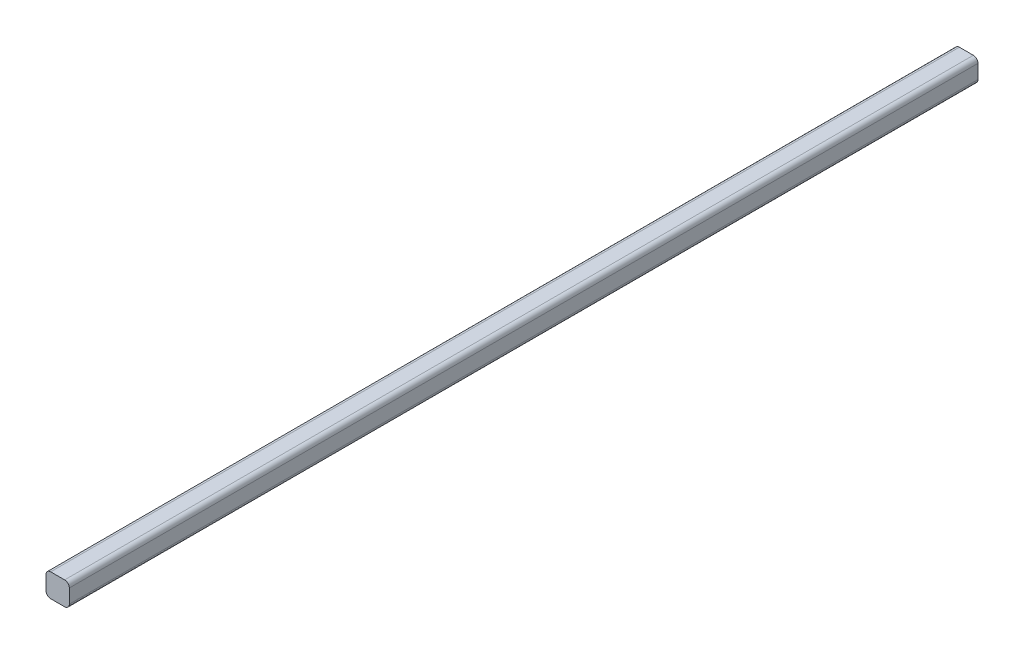
ISO-10303-21;
HEADER;
FILE_DESCRIPTION(('STEP AP214'),'2;1');
FILE_NAME('part.step','',(''),(''),'','','');
FILE_SCHEMA(('AUTOMOTIVE_DESIGN { 1 0 10303 214 1 1 1 1 }'));
ENDSEC;
DATA;
#1=APPLICATION_CONTEXT('core data for automotive mechanical design processes');
#2=APPLICATION_PROTOCOL_DEFINITION('international standard','automotive_design',2000,#1);
#3=PRODUCT_CONTEXT('',#1,'mechanical');
#4=PRODUCT('Part','Part','',(#3));
#5=PRODUCT_RELATED_PRODUCT_CATEGORY('part','',(#4));
#6=PRODUCT_DEFINITION_FORMATION('','',#4);
#7=PRODUCT_DEFINITION_CONTEXT('part definition',#1,'design');
#8=PRODUCT_DEFINITION('design','',#6,#7);
#9=PRODUCT_DEFINITION_SHAPE('','',#8);
#10=(LENGTH_UNIT() NAMED_UNIT(*) SI_UNIT(.MILLI.,.METRE.));
#11=(NAMED_UNIT(*) PLANE_ANGLE_UNIT() SI_UNIT($,.RADIAN.));
#12=(NAMED_UNIT(*) SI_UNIT($,.STERADIAN.) SOLID_ANGLE_UNIT());
#13=UNCERTAINTY_MEASURE_WITH_UNIT(LENGTH_MEASURE(1.E-05),#10,'distance_accuracy_value','');
#14=(GEOMETRIC_REPRESENTATION_CONTEXT(3) GLOBAL_UNCERTAINTY_ASSIGNED_CONTEXT((#13)) GLOBAL_UNIT_ASSIGNED_CONTEXT((#10,
#11,#12)) REPRESENTATION_CONTEXT('',''));
#15=CARTESIAN_POINT('',(0.,0.,0.));
#16=DIRECTION('',(0.,0.,1.));
#17=DIRECTION('',(1.,0.,0.));
#18=AXIS2_PLACEMENT_3D('',#15,#16,#17);
#19=CARTESIAN_POINT('',(0.,0.,1950.));
#20=DIRECTION('',(1.,0.,0.));
#21=DIRECTION('',(0.,0.,-1.));
#22=AXIS2_PLACEMENT_3D('',#19,#20,#21);
#23=PLANE('',#22);
#24=DIRECTION('',(0.,-1.,0.));
#25=VECTOR('',#24,1.);
#26=CARTESIAN_POINT('',(0.,0.,0.));
#27=LINE('',#26,#25);
#28=CARTESIAN_POINT('',(0.,40.,0.));
#29=VERTEX_POINT('',#28);
#30=CARTESIAN_POINT('',(0.,10.,0.));
#31=VERTEX_POINT('',#30);
#32=EDGE_CURVE('E125',#29,#31,#27,.T.);
#33=ORIENTED_EDGE('',*,*,#32,.T.);
#34=DIRECTION('',(0.,0.,-1.));
#35=VECTOR('',#34,1.);
#36=CARTESIAN_POINT('',(0.,10.,1950.));
#37=LINE('',#36,#35);
#38=CARTESIAN_POINT('',(0.,10.,1950.));
#39=VERTEX_POINT('',#38);
#40=EDGE_CURVE('E103',#31,#39,#37,.F.);
#41=ORIENTED_EDGE('',*,*,#40,.T.);
#42=DIRECTION('',(0.,-1.,0.));
#43=VECTOR('',#42,1.);
#44=CARTESIAN_POINT('',(0.,0.,1950.));
#45=LINE('',#44,#43);
#46=CARTESIAN_POINT('',(0.,40.,1950.));
#47=VERTEX_POINT('',#46);
#48=EDGE_CURVE('E134',#47,#39,#45,.T.);
#49=ORIENTED_EDGE('',*,*,#48,.F.);
#50=DIRECTION('',(0.,0.,-1.));
#51=VECTOR('',#50,1.);
#52=CARTESIAN_POINT('',(0.,40.,1950.));
#53=LINE('',#52,#51);
#54=EDGE_CURVE('E108',#47,#29,#53,.T.);
#55=ORIENTED_EDGE('',*,*,#54,.T.);
#56=EDGE_LOOP('',(#33,#41,#49,#55));
#57=FACE_BOUND('',#56,.T.);
#58=ADVANCED_FACE('F33',(#57),#23,.F.);
#59=CARTESIAN_POINT('',(0.,0.,1950.));
#60=DIRECTION('',(0.,1.,0.));
#61=DIRECTION('',(0.,0.,1.));
#62=AXIS2_PLACEMENT_3D('',#59,#60,#61);
#63=PLANE('',#62);
#64=DIRECTION('',(1.,0.,0.));
#65=VECTOR('',#64,1.);
#66=CARTESIAN_POINT('',(0.,0.,1950.));
#67=LINE('',#66,#65);
#68=CARTESIAN_POINT('',(10.,0.,1950.));
#69=VERTEX_POINT('',#68);
#70=CARTESIAN_POINT('',(40.,0.,1950.));
#71=VERTEX_POINT('',#70);
#72=EDGE_CURVE('E118',#69,#71,#67,.T.);
#73=ORIENTED_EDGE('',*,*,#72,.F.);
#74=DIRECTION('',(0.,0.,-1.));
#75=VECTOR('',#74,1.);
#76=CARTESIAN_POINT('',(10.,0.,1950.));
#77=LINE('',#76,#75);
#78=CARTESIAN_POINT('',(10.,0.,0.));
#79=VERTEX_POINT('',#78);
#80=EDGE_CURVE('E102',#69,#79,#77,.T.);
#81=ORIENTED_EDGE('',*,*,#80,.T.);
#82=DIRECTION('',(1.,0.,0.));
#83=VECTOR('',#82,1.);
#84=CARTESIAN_POINT('',(0.,0.,0.));
#85=LINE('',#84,#83);
#86=CARTESIAN_POINT('',(40.,0.,0.));
#87=VERTEX_POINT('',#86);
#88=EDGE_CURVE('E115',#79,#87,#85,.T.);
#89=ORIENTED_EDGE('',*,*,#88,.T.);
#90=DIRECTION('',(0.,0.,-1.));
#91=VECTOR('',#90,1.);
#92=CARTESIAN_POINT('',(40.,0.,1950.));
#93=LINE('',#92,#91);
#94=EDGE_CURVE('E120',#87,#71,#93,.F.);
#95=ORIENTED_EDGE('',*,*,#94,.T.);
#96=EDGE_LOOP('',(#73,#81,#89,#95));
#97=FACE_BOUND('',#96,.T.);
#98=ADVANCED_FACE('F114',(#97),#63,.F.);
#99=CARTESIAN_POINT('',(50.,0.,1950.));
#100=DIRECTION('',(-1.,0.,0.));
#101=DIRECTION('',(0.,0.,1.));
#102=AXIS2_PLACEMENT_3D('',#99,#100,#101);
#103=PLANE('',#102);
#104=DIRECTION('',(0.,1.,0.));
#105=VECTOR('',#104,1.);
#106=CARTESIAN_POINT('',(50.,0.,1950.));
#107=LINE('',#106,#105);
#108=CARTESIAN_POINT('',(50.,10.,1950.));
#109=VERTEX_POINT('',#108);
#110=CARTESIAN_POINT('',(50.,40.,1950.));
#111=VERTEX_POINT('',#110);
#112=EDGE_CURVE('E168',#109,#111,#107,.T.);
#113=ORIENTED_EDGE('',*,*,#112,.F.);
#114=DIRECTION('',(0.,0.,-1.));
#115=VECTOR('',#114,1.);
#116=CARTESIAN_POINT('',(50.,10.,1950.));
#117=LINE('',#116,#115);
#118=CARTESIAN_POINT('',(50.,10.,0.));
#119=VERTEX_POINT('',#118);
#120=EDGE_CURVE('E153',#109,#119,#117,.T.);
#121=ORIENTED_EDGE('',*,*,#120,.T.);
#122=DIRECTION('',(0.,1.,0.));
#123=VECTOR('',#122,1.);
#124=CARTESIAN_POINT('',(50.,0.,0.));
#125=LINE('',#124,#123);
#126=CARTESIAN_POINT('',(50.,40.,0.));
#127=VERTEX_POINT('',#126);
#128=EDGE_CURVE('E124',#119,#127,#125,.T.);
#129=ORIENTED_EDGE('',*,*,#128,.T.);
#130=DIRECTION('',(0.,0.,-1.));
#131=VECTOR('',#130,1.);
#132=CARTESIAN_POINT('',(50.,40.,1950.));
#133=LINE('',#132,#131);
#134=EDGE_CURVE('E151',#127,#111,#133,.F.);
#135=ORIENTED_EDGE('',*,*,#134,.T.);
#136=EDGE_LOOP('',(#113,#121,#129,#135));
#137=FACE_BOUND('',#136,.T.);
#138=ADVANCED_FACE('F179',(#137),#103,.F.);
#139=CARTESIAN_POINT('',(0.,50.,1950.));
#140=DIRECTION('',(0.,-1.,0.));
#141=DIRECTION('',(0.,0.,-1.));
#142=AXIS2_PLACEMENT_3D('',#139,#140,#141);
#143=PLANE('',#142);
#144=DIRECTION('',(-1.,0.,0.));
#145=VECTOR('',#144,1.);
#146=CARTESIAN_POINT('',(0.,50.,0.));
#147=LINE('',#146,#145);
#148=CARTESIAN_POINT('',(40.,50.,0.));
#149=VERTEX_POINT('',#148);
#150=CARTESIAN_POINT('',(10.,50.,0.));
#151=VERTEX_POINT('',#150);
#152=EDGE_CURVE('E128',#149,#151,#147,.T.);
#153=ORIENTED_EDGE('',*,*,#152,.T.);
#154=DIRECTION('',(0.,0.,-1.));
#155=VECTOR('',#154,1.);
#156=CARTESIAN_POINT('',(10.,50.,1950.));
#157=LINE('',#156,#155);
#158=CARTESIAN_POINT('',(10.,50.,1950.));
#159=VERTEX_POINT('',#158);
#160=EDGE_CURVE('E11',#151,#159,#157,.F.);
#161=ORIENTED_EDGE('',*,*,#160,.T.);
#162=DIRECTION('',(-1.,0.,0.));
#163=VECTOR('',#162,1.);
#164=CARTESIAN_POINT('',(0.,50.,1950.));
#165=LINE('',#164,#163);
#166=CARTESIAN_POINT('',(40.,50.,1950.));
#167=VERTEX_POINT('',#166);
#168=EDGE_CURVE('E135',#167,#159,#165,.T.);
#169=ORIENTED_EDGE('',*,*,#168,.F.);
#170=DIRECTION('',(0.,0.,-1.));
#171=VECTOR('',#170,1.);
#172=CARTESIAN_POINT('',(40.,50.,1950.));
#173=LINE('',#172,#171);
#174=EDGE_CURVE('E41',#167,#149,#173,.T.);
#175=ORIENTED_EDGE('',*,*,#174,.T.);
#176=EDGE_LOOP('',(#153,#161,#169,#175));
#177=FACE_BOUND('',#176,.T.);
#178=ADVANCED_FACE('F158',(#177),#143,.F.);
#179=CARTESIAN_POINT('',(0.,0.,1950.));
#180=DIRECTION('',(0.,0.,-1.));
#181=DIRECTION('',(-1.,0.,0.));
#182=AXIS2_PLACEMENT_3D('',#179,#180,#181);
#183=PLANE('',#182);
#184=ORIENTED_EDGE('',*,*,#48,.T.);
#185=CARTESIAN_POINT('',(10.,10.,1950.));
#186=DIRECTION('',(0.,0.,-1.));
#187=DIRECTION('',(-1.,0.,0.));
#188=AXIS2_PLACEMENT_3D('',#185,#186,#187);
#189=CIRCLE('',#188,10.);
#190=EDGE_CURVE('E149',#39,#69,#189,.F.);
#191=ORIENTED_EDGE('',*,*,#190,.T.);
#192=ORIENTED_EDGE('',*,*,#72,.T.);
#193=CARTESIAN_POINT('',(40.,10.,1950.));
#194=DIRECTION('',(0.,0.,-1.));
#195=DIRECTION('',(-1.,0.,0.));
#196=AXIS2_PLACEMENT_3D('',#193,#194,#195);
#197=CIRCLE('',#196,10.);
#198=EDGE_CURVE('E147',#71,#109,#197,.F.);
#199=ORIENTED_EDGE('',*,*,#198,.T.);
#200=ORIENTED_EDGE('',*,*,#112,.T.);
#201=CARTESIAN_POINT('',(40.,40.,1950.));
#202=DIRECTION('',(0.,0.,-1.));
#203=DIRECTION('',(-1.,0.,0.));
#204=AXIS2_PLACEMENT_3D('',#201,#202,#203);
#205=CIRCLE('',#204,10.);
#206=EDGE_CURVE('E53',#111,#167,#205,.F.);
#207=ORIENTED_EDGE('',*,*,#206,.T.);
#208=ORIENTED_EDGE('',*,*,#168,.T.);
#209=CARTESIAN_POINT('',(10.,40.,1950.));
#210=DIRECTION('',(0.,0.,-1.));
#211=DIRECTION('',(-1.,0.,0.));
#212=AXIS2_PLACEMENT_3D('',#209,#210,#211);
#213=CIRCLE('',#212,10.);
#214=EDGE_CURVE('E145',#159,#47,#213,.F.);
#215=ORIENTED_EDGE('',*,*,#214,.T.);
#216=EDGE_LOOP('',(#184,#191,#192,#199,#200,#207,#208,#215));
#217=FACE_BOUND('',#216,.T.);
#218=ADVANCED_FACE('F171',(#217),#183,.F.);
#219=CARTESIAN_POINT('',(0.,0.,0.));
#220=DIRECTION('',(0.,0.,-1.));
#221=DIRECTION('',(-1.,0.,0.));
#222=AXIS2_PLACEMENT_3D('',#219,#220,#221);
#223=PLANE('',#222);
#224=ORIENTED_EDGE('',*,*,#88,.F.);
#225=CARTESIAN_POINT('',(10.,10.,0.));
#226=DIRECTION('',(0.,0.,-1.));
#227=DIRECTION('',(-1.,0.,0.));
#228=AXIS2_PLACEMENT_3D('',#225,#226,#227);
#229=CIRCLE('',#228,10.);
#230=EDGE_CURVE('E98',#79,#31,#229,.T.);
#231=ORIENTED_EDGE('',*,*,#230,.T.);
#232=ORIENTED_EDGE('',*,*,#32,.F.);
#233=CARTESIAN_POINT('',(10.,40.,0.));
#234=DIRECTION('',(0.,0.,-1.));
#235=DIRECTION('',(-1.,0.,0.));
#236=AXIS2_PLACEMENT_3D('',#233,#234,#235);
#237=CIRCLE('',#236,10.);
#238=EDGE_CURVE('E138',#29,#151,#237,.T.);
#239=ORIENTED_EDGE('',*,*,#238,.T.);
#240=ORIENTED_EDGE('',*,*,#152,.F.);
#241=CARTESIAN_POINT('',(40.,40.,0.));
#242=DIRECTION('',(0.,0.,-1.));
#243=DIRECTION('',(-1.,0.,0.));
#244=AXIS2_PLACEMENT_3D('',#241,#242,#243);
#245=CIRCLE('',#244,10.);
#246=EDGE_CURVE('E119',#149,#127,#245,.T.);
#247=ORIENTED_EDGE('',*,*,#246,.T.);
#248=ORIENTED_EDGE('',*,*,#128,.F.);
#249=CARTESIAN_POINT('',(40.,10.,0.));
#250=DIRECTION('',(0.,0.,-1.));
#251=DIRECTION('',(-1.,0.,0.));
#252=AXIS2_PLACEMENT_3D('',#249,#250,#251);
#253=CIRCLE('',#252,10.);
#254=EDGE_CURVE('E109',#119,#87,#253,.T.);
#255=ORIENTED_EDGE('',*,*,#254,.T.);
#256=EDGE_LOOP('',(#224,#231,#232,#239,#240,#247,#248,#255));
#257=FACE_BOUND('',#256,.T.);
#258=ADVANCED_FACE('F122',(#257),#223,.T.);
#259=CARTESIAN_POINT('',(10.,10.,1950.));
#260=DIRECTION('',(0.,0.,-1.));
#261=DIRECTION('',(-1.,0.,0.));
#262=AXIS2_PLACEMENT_3D('',#259,#260,#261);
#263=CYLINDRICAL_SURFACE('',#262,10.);
#264=ORIENTED_EDGE('',*,*,#190,.F.);
#265=ORIENTED_EDGE('',*,*,#40,.F.);
#266=ORIENTED_EDGE('',*,*,#230,.F.);
#267=ORIENTED_EDGE('',*,*,#80,.F.);
#268=EDGE_LOOP('',(#264,#265,#266,#267));
#269=FACE_BOUND('',#268,.T.);
#270=ADVANCED_FACE('F101',(#269),#263,.T.);
#271=CARTESIAN_POINT('',(40.,10.,1950.));
#272=DIRECTION('',(0.,0.,-1.));
#273=DIRECTION('',(-1.,0.,0.));
#274=AXIS2_PLACEMENT_3D('',#271,#272,#273);
#275=CYLINDRICAL_SURFACE('',#274,10.);
#276=ORIENTED_EDGE('',*,*,#198,.F.);
#277=ORIENTED_EDGE('',*,*,#94,.F.);
#278=ORIENTED_EDGE('',*,*,#254,.F.);
#279=ORIENTED_EDGE('',*,*,#120,.F.);
#280=EDGE_LOOP('',(#276,#277,#278,#279));
#281=FACE_BOUND('',#280,.T.);
#282=ADVANCED_FACE('F191',(#281),#275,.T.);
#283=CARTESIAN_POINT('',(10.,40.,1950.));
#284=DIRECTION('',(0.,0.,-1.));
#285=DIRECTION('',(-1.,0.,0.));
#286=AXIS2_PLACEMENT_3D('',#283,#284,#285);
#287=CYLINDRICAL_SURFACE('',#286,10.);
#288=ORIENTED_EDGE('',*,*,#214,.F.);
#289=ORIENTED_EDGE('',*,*,#160,.F.);
#290=ORIENTED_EDGE('',*,*,#238,.F.);
#291=ORIENTED_EDGE('',*,*,#54,.F.);
#292=EDGE_LOOP('',(#288,#289,#290,#291));
#293=FACE_BOUND('',#292,.T.);
#294=ADVANCED_FACE('F163',(#293),#287,.T.);
#295=CARTESIAN_POINT('',(40.,40.,1950.));
#296=DIRECTION('',(0.,0.,-1.));
#297=DIRECTION('',(-1.,0.,0.));
#298=AXIS2_PLACEMENT_3D('',#295,#296,#297);
#299=CYLINDRICAL_SURFACE('',#298,10.);
#300=ORIENTED_EDGE('',*,*,#206,.F.);
#301=ORIENTED_EDGE('',*,*,#134,.F.);
#302=ORIENTED_EDGE('',*,*,#246,.F.);
#303=ORIENTED_EDGE('',*,*,#174,.F.);
#304=EDGE_LOOP('',(#300,#301,#302,#303));
#305=FACE_BOUND('',#304,.T.);
#306=ADVANCED_FACE('F35',(#305),#299,.T.);
#307=CLOSED_SHELL('',(#58,#98,#138,#178,#218,#258,#270,#282,#294,#306));
#308=MANIFOLD_SOLID_BREP('B2',#307);
#309=ADVANCED_BREP_SHAPE_REPRESENTATION('',(#18,#308),#14);
#310=SHAPE_DEFINITION_REPRESENTATION(#9,#309);
ENDSEC;
END-ISO-10303-21;
